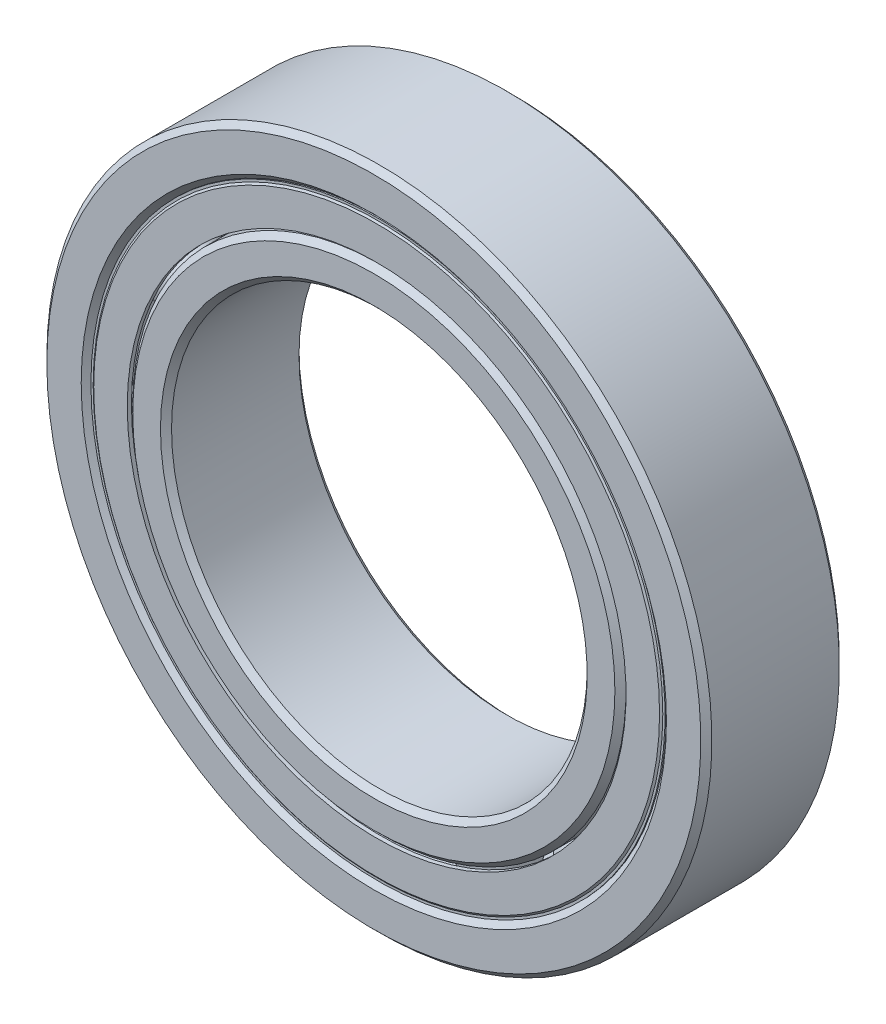
ISO-10303-21;
HEADER;
FILE_DESCRIPTION(('STEP AP214'),'2;1');
FILE_NAME('part.step','',(''),(''),'','','');
FILE_SCHEMA(('AUTOMOTIVE_DESIGN { 1 0 10303 214 1 1 1 1 }'));
ENDSEC;
DATA;
#1=APPLICATION_CONTEXT('core data for automotive mechanical design processes');
#2=APPLICATION_PROTOCOL_DEFINITION('international standard','automotive_design',2000,#1);
#3=PRODUCT_CONTEXT('',#1,'mechanical');
#4=PRODUCT('Part','Part','',(#3));
#5=PRODUCT_RELATED_PRODUCT_CATEGORY('part','',(#4));
#6=PRODUCT_DEFINITION_FORMATION('','',#4);
#7=PRODUCT_DEFINITION_CONTEXT('part definition',#1,'design');
#8=PRODUCT_DEFINITION('design','',#6,#7);
#9=PRODUCT_DEFINITION_SHAPE('','',#8);
#10=(LENGTH_UNIT() NAMED_UNIT(*) SI_UNIT(.MILLI.,.METRE.));
#11=(NAMED_UNIT(*) PLANE_ANGLE_UNIT() SI_UNIT($,.RADIAN.));
#12=(NAMED_UNIT(*) SI_UNIT($,.STERADIAN.) SOLID_ANGLE_UNIT());
#13=UNCERTAINTY_MEASURE_WITH_UNIT(LENGTH_MEASURE(1.E-05),#10,'distance_accuracy_value','');
#14=(GEOMETRIC_REPRESENTATION_CONTEXT(3) GLOBAL_UNCERTAINTY_ASSIGNED_CONTEXT((#13)) GLOBAL_UNIT_ASSIGNED_CONTEXT((#10,
#11,#12)) REPRESENTATION_CONTEXT('',''));
#15=CARTESIAN_POINT('',(0.,0.,0.));
#16=DIRECTION('',(0.,0.,1.));
#17=DIRECTION('',(1.,0.,0.));
#18=AXIS2_PLACEMENT_3D('',#15,#16,#17);
#19=CARTESIAN_POINT('',(-9.1586742519223,2.97583365583084,0.));
#20=DIRECTION('',(0.,0.,1.));
#21=DIRECTION('',(-0.95105651629515,0.309016994374957,0.));
#22=AXIS2_PLACEMENT_3D('',#19,#20,#21);
#23=SPHERICAL_SURFACE('',#22,1.1905);
#24=CARTESIAN_POINT('',(-9.1586742519223,2.97583365583084,1.1905));
#25=VERTEX_POINT('',#24);
#26=VERTEX_LOOP('',#25);
#27=FACE_BOUND('',#26,.T.);
#28=ADVANCED_FACE('P0_F13',(#27),#23,.T.);
#29=CLOSED_SHELL('',(#28));
#30=MANIFOLD_SOLID_BREP('P0_B1',#29);
#31=CARTESIAN_POINT('',(-7.15648466934723,6.44372773923589,0.));
#32=DIRECTION('',(0.,0.,1.));
#33=DIRECTION('',(-0.743144825477386,0.669130606358867,0.));
#34=AXIS2_PLACEMENT_3D('',#31,#32,#33);
#35=SPHERICAL_SURFACE('',#34,1.1905);
#36=CARTESIAN_POINT('',(-7.15648466934723,6.44372773923589,1.1905));
#37=VERTEX_POINT('',#36);
#38=VERTEX_LOOP('',#37);
#39=FACE_BOUND('',#38,.T.);
#40=ADVANCED_FACE('P1_F13',(#39),#35,.T.);
#41=CLOSED_SHELL('',(#40));
#42=MANIFOLD_SOLID_BREP('P1_B1',#41);
#43=CARTESIAN_POINT('',(-3.91687387281985,8.7974427570983,0.));
#44=DIRECTION('',(0.,0.,1.));
#45=DIRECTION('',(-0.406736643075789,0.913545457642606,0.));
#46=AXIS2_PLACEMENT_3D('',#43,#44,#45);
#47=SPHERICAL_SURFACE('',#46,1.1905);
#48=CARTESIAN_POINT('',(-3.91687387281985,8.7974427570983,1.1905));
#49=VERTEX_POINT('',#48);
#50=VERTEX_LOOP('',#49);
#51=FACE_BOUND('',#50,.T.);
#52=ADVANCED_FACE('P2_F13',(#51),#47,.T.);
#53=CLOSED_SHELL('',(#52));
#54=MANIFOLD_SOLID_BREP('P2_B1',#53);
#55=CARTESIAN_POINT('',(0.,10.21,2.21501856481158));
#56=DIRECTION('',(0.,0.,-1.));
#57=DIRECTION('',(-1.,0.,0.));
#58=AXIS2_PLACEMENT_3D('',#55,#56,#57);
#59=PLANE('',#58);
#60=CARTESIAN_POINT('',(0.,0.,2.21501856481158));
#61=DIRECTION('',(0.,0.,-1.));
#62=DIRECTION('',(-1.,0.,0.));
#63=AXIS2_PLACEMENT_3D('',#60,#61,#62);
#64=CIRCLE('',#63,10.36);
#65=CARTESIAN_POINT('',(-10.36,0.,2.21501856481158));
#66=VERTEX_POINT('',#65);
#67=EDGE_CURVE('P3_E43',#66,#66,#64,.T.);
#68=ORIENTED_EDGE('',*,*,#67,.T.);
#69=EDGE_LOOP('',(#68));
#70=FACE_BOUND('',#69,.T.);
#71=CARTESIAN_POINT('',(0.,0.,2.21501856481158));
#72=DIRECTION('',(0.,0.,-1.));
#73=DIRECTION('',(-1.,0.,0.));
#74=AXIS2_PLACEMENT_3D('',#71,#72,#73);
#75=CIRCLE('',#74,10.21);
#76=CARTESIAN_POINT('',(-10.21,0.,2.21501856481158));
#77=VERTEX_POINT('',#76);
#78=EDGE_CURVE('P3_E10',#77,#77,#75,.T.);
#79=ORIENTED_EDGE('',*,*,#78,.F.);
#80=EDGE_LOOP('',(#79));
#81=FACE_BOUND('',#80,.T.);
#82=ADVANCED_FACE('P3_F15',(#70,#81),#59,.T.);
#83=CARTESIAN_POINT('',(0.,0.,2.2481347531258));
#84=DIRECTION('',(0.,0.,-1.));
#85=DIRECTION('',(-1.,0.,0.));
#86=AXIS2_PLACEMENT_3D('',#83,#84,#85);
#87=CONICAL_SURFACE('',#86,10.1627051816681,0.959931088596877);
#88=ORIENTED_EDGE('',*,*,#78,.T.);
#89=EDGE_LOOP('',(#88));
#90=FACE_BOUND('',#89,.T.);
#91=CARTESIAN_POINT('',(0.,0.,2.2481347531258));
#92=DIRECTION('',(0.,0.,-1.));
#93=DIRECTION('',(-1.,0.,0.));
#94=AXIS2_PLACEMENT_3D('',#91,#92,#93);
#95=CIRCLE('',#94,10.1627051816681);
#96=CARTESIAN_POINT('',(-10.1627051816681,0.,2.2481347531258));
#97=VERTEX_POINT('',#96);
#98=EDGE_CURVE('P3_E21',#97,#97,#95,.T.);
#99=ORIENTED_EDGE('',*,*,#98,.F.);
#100=EDGE_LOOP('',(#99));
#101=FACE_BOUND('',#100,.T.);
#102=ADVANCED_FACE('P3_F63',(#90,#101),#87,.F.);
#103=CARTESIAN_POINT('',(0.,10.1627051816681,2.2481347531258));
#104=DIRECTION('',(0.,0.,-1.));
#105=DIRECTION('',(-1.,0.,0.));
#106=AXIS2_PLACEMENT_3D('',#103,#104,#105);
#107=PLANE('',#106);
#108=ORIENTED_EDGE('',*,*,#98,.T.);
#109=EDGE_LOOP('',(#108));
#110=FACE_BOUND('',#109,.T.);
#111=CARTESIAN_POINT('',(0.,0.,2.2481347531258));
#112=DIRECTION('',(0.,0.,-1.));
#113=DIRECTION('',(-1.,0.,0.));
#114=AXIS2_PLACEMENT_3D('',#111,#112,#113);
#115=CIRCLE('',#114,9.);
#116=CARTESIAN_POINT('',(-9.,0.,2.2481347531258));
#117=VERTEX_POINT('',#116);
#118=EDGE_CURVE('P3_E25',#117,#117,#115,.T.);
#119=ORIENTED_EDGE('',*,*,#118,.F.);
#120=EDGE_LOOP('',(#119));
#121=FACE_BOUND('',#120,.T.);
#122=ADVANCED_FACE('P3_F68',(#110,#121),#107,.T.);
#123=CARTESIAN_POINT('',(0.,0.,0.));
#124=DIRECTION('',(0.,0.,-1.));
#125=DIRECTION('',(-1.,0.,0.));
#126=AXIS2_PLACEMENT_3D('',#123,#124,#125);
#127=CYLINDRICAL_SURFACE('',#126,9.);
#128=ORIENTED_EDGE('',*,*,#118,.T.);
#129=EDGE_LOOP('',(#128));
#130=FACE_BOUND('',#129,.T.);
#131=CARTESIAN_POINT('',(0.,0.,2.3981347531258));
#132=DIRECTION('',(0.,0.,-1.));
#133=DIRECTION('',(-1.,0.,0.));
#134=AXIS2_PLACEMENT_3D('',#131,#132,#133);
#135=CIRCLE('',#134,9.);
#136=CARTESIAN_POINT('',(-9.,0.,2.3981347531258));
#137=VERTEX_POINT('',#136);
#138=EDGE_CURVE('P3_E29',#137,#137,#135,.T.);
#139=ORIENTED_EDGE('',*,*,#138,.F.);
#140=EDGE_LOOP('',(#139));
#141=FACE_BOUND('',#140,.T.);
#142=ADVANCED_FACE('P3_F73',(#130,#141),#127,.F.);
#143=CARTESIAN_POINT('',(0.,10.21,2.3981347531258));
#144=DIRECTION('',(0.,0.,1.));
#145=DIRECTION('',(1.,0.,0.));
#146=AXIS2_PLACEMENT_3D('',#143,#144,#145);
#147=PLANE('',#146);
#148=ORIENTED_EDGE('',*,*,#138,.T.);
#149=EDGE_LOOP('',(#148));
#150=FACE_BOUND('',#149,.T.);
#151=CARTESIAN_POINT('',(0.,0.,2.3981347531258));
#152=DIRECTION('',(0.,0.,-1.));
#153=DIRECTION('',(-1.,0.,0.));
#154=AXIS2_PLACEMENT_3D('',#151,#152,#153);
#155=CIRCLE('',#154,10.21);
#156=CARTESIAN_POINT('',(-10.21,0.,2.3981347531258));
#157=VERTEX_POINT('',#156);
#158=EDGE_CURVE('P3_E34',#157,#157,#155,.T.);
#159=ORIENTED_EDGE('',*,*,#158,.F.);
#160=EDGE_LOOP('',(#159));
#161=FACE_BOUND('',#160,.T.);
#162=ADVANCED_FACE('P3_F79',(#150,#161),#147,.T.);
#163=CARTESIAN_POINT('',(0.,0.,2.35));
#164=DIRECTION('',(0.,0.,-1.));
#165=DIRECTION('',(-1.,0.,0.));
#166=AXIS2_PLACEMENT_3D('',#163,#164,#165);
#167=CONICAL_SURFACE('',#166,10.2787435517316,0.959931088596883);
#168=ORIENTED_EDGE('',*,*,#158,.T.);
#169=EDGE_LOOP('',(#168));
#170=FACE_BOUND('',#169,.T.);
#171=CARTESIAN_POINT('',(0.,0.,2.35));
#172=DIRECTION('',(0.,0.,-1.));
#173=DIRECTION('',(-1.,0.,0.));
#174=AXIS2_PLACEMENT_3D('',#171,#172,#173);
#175=CIRCLE('',#174,10.2787435517316);
#176=CARTESIAN_POINT('',(-10.2787435517316,0.,2.35));
#177=VERTEX_POINT('',#176);
#178=EDGE_CURVE('P3_E37',#177,#177,#175,.T.);
#179=ORIENTED_EDGE('',*,*,#178,.F.);
#180=EDGE_LOOP('',(#179));
#181=FACE_BOUND('',#180,.T.);
#182=ADVANCED_FACE('P3_F59',(#170,#181),#167,.T.);
#183=CARTESIAN_POINT('',(0.,10.36,2.35));
#184=DIRECTION('',(0.,0.,1.));
#185=DIRECTION('',(1.,0.,0.));
#186=AXIS2_PLACEMENT_3D('',#183,#184,#185);
#187=PLANE('',#186);
#188=ORIENTED_EDGE('',*,*,#178,.T.);
#189=EDGE_LOOP('',(#188));
#190=FACE_BOUND('',#189,.T.);
#191=CARTESIAN_POINT('',(0.,0.,2.35));
#192=DIRECTION('',(0.,0.,-1.));
#193=DIRECTION('',(-1.,0.,0.));
#194=AXIS2_PLACEMENT_3D('',#191,#192,#193);
#195=CIRCLE('',#194,10.36);
#196=CARTESIAN_POINT('',(-10.36,0.,2.35));
#197=VERTEX_POINT('',#196);
#198=EDGE_CURVE('P3_E40',#197,#197,#195,.T.);
#199=ORIENTED_EDGE('',*,*,#198,.F.);
#200=EDGE_LOOP('',(#199));
#201=FACE_BOUND('',#200,.T.);
#202=ADVANCED_FACE('P3_F51',(#190,#201),#187,.T.);
#203=CARTESIAN_POINT('',(0.,0.,0.));
#204=DIRECTION('',(0.,0.,-1.));
#205=DIRECTION('',(-1.,0.,0.));
#206=AXIS2_PLACEMENT_3D('',#203,#204,#205);
#207=CYLINDRICAL_SURFACE('',#206,10.36);
#208=ORIENTED_EDGE('',*,*,#198,.T.);
#209=EDGE_LOOP('',(#208));
#210=FACE_BOUND('',#209,.T.);
#211=ORIENTED_EDGE('',*,*,#67,.F.);
#212=EDGE_LOOP('',(#211));
#213=FACE_BOUND('',#212,.T.);
#214=ADVANCED_FACE('P3_F49',(#210,#213),#207,.T.);
#215=CLOSED_SHELL('',(#82,#102,#122,#142,#162,#182,#202,#214));
#216=MANIFOLD_SOLID_BREP('P3_B1',#215);
#217=CARTESIAN_POINT('',(0.,9.63,0.));
#218=DIRECTION('',(0.,0.,1.));
#219=DIRECTION('',(0.,1.,0.));
#220=AXIS2_PLACEMENT_3D('',#217,#218,#219);
#221=SPHERICAL_SURFACE('',#220,1.1905);
#222=CARTESIAN_POINT('',(0.,9.63,1.1905));
#223=VERTEX_POINT('',#222);
#224=VERTEX_LOOP('',#223);
#225=FACE_BOUND('',#224,.T.);
#226=ADVANCED_FACE('P4_F13',(#225),#221,.T.);
#227=CLOSED_SHELL('',(#226));
#228=MANIFOLD_SOLID_BREP('P4_B1',#227);
#229=CARTESIAN_POINT('',(3.91687387281997,8.79744275709824,0.));
#230=DIRECTION('',(0.,0.,1.));
#231=DIRECTION('',(0.406736643075801,0.913545457642601,0.));
#232=AXIS2_PLACEMENT_3D('',#229,#230,#231);
#233=SPHERICAL_SURFACE('',#232,1.1905);
#234=CARTESIAN_POINT('',(3.91687387281997,8.79744275709824,1.1905));
#235=VERTEX_POINT('',#234);
#236=VERTEX_LOOP('',#235);
#237=FACE_BOUND('',#236,.T.);
#238=ADVANCED_FACE('P5_F13',(#237),#233,.T.);
#239=CLOSED_SHELL('',(#238));
#240=MANIFOLD_SOLID_BREP('P5_B1',#239);
#241=CARTESIAN_POINT('',(7.15648466934732,6.44372773923579,0.));
#242=DIRECTION('',(0.,0.,1.));
#243=DIRECTION('',(0.743144825477396,0.669130606358857,0.));
#244=AXIS2_PLACEMENT_3D('',#241,#242,#243);
#245=SPHERICAL_SURFACE('',#244,1.1905);
#246=CARTESIAN_POINT('',(7.15648466934732,6.44372773923579,1.1905));
#247=VERTEX_POINT('',#246);
#248=VERTEX_LOOP('',#247);
#249=FACE_BOUND('',#248,.T.);
#250=ADVANCED_FACE('P6_F13',(#249),#245,.T.);
#251=CLOSED_SHELL('',(#250));
#252=MANIFOLD_SOLID_BREP('P6_B1',#251);
#253=CARTESIAN_POINT('',(9.15867425192234,2.97583365583072,0.));
#254=DIRECTION('',(0.,0.,1.));
#255=DIRECTION('',(0.951056516295154,0.309016994374945,0.));
#256=AXIS2_PLACEMENT_3D('',#253,#254,#255);
#257=SPHERICAL_SURFACE('',#256,1.1905);
#258=CARTESIAN_POINT('',(9.15867425192234,2.97583365583072,1.1905));
#259=VERTEX_POINT('',#258);
#260=VERTEX_LOOP('',#259);
#261=FACE_BOUND('',#260,.T.);
#262=ADVANCED_FACE('P7_F13',(#261),#257,.T.);
#263=CLOSED_SHELL('',(#262));
#264=MANIFOLD_SOLID_BREP('P7_B1',#263);
#265=CARTESIAN_POINT('',(9.57724585239647,-1.00660910126754,0.));
#266=DIRECTION('',(0.,0.,1.));
#267=DIRECTION('',(0.994521895368273,-0.104528463267657,0.));
#268=AXIS2_PLACEMENT_3D('',#265,#266,#267);
#269=SPHERICAL_SURFACE('',#268,1.1905);
#270=CARTESIAN_POINT('',(9.57724585239647,-1.00660910126754,1.1905));
#271=VERTEX_POINT('',#270);
#272=VERTEX_LOOP('',#271);
#273=FACE_BOUND('',#272,.T.);
#274=ADVANCED_FACE('P8_F13',(#273),#269,.T.);
#275=CLOSED_SHELL('',(#274));
#276=MANIFOLD_SOLID_BREP('P8_B1',#275);
#277=CARTESIAN_POINT('',(0.,0.,0.));
#278=DIRECTION('',(0.,0.,-1.));
#279=DIRECTION('',(-1.,0.,0.));
#280=AXIS2_PLACEMENT_3D('',#277,#278,#279);
#281=TOROIDAL_SURFACE('',#280,9.63,0.74188633318957);
#282=CARTESIAN_POINT('',(0.,0.,-0.132269918626519));
#283=DIRECTION('',(0.,0.,-1.));
#284=DIRECTION('',(-1.,0.,0.));
#285=AXIS2_PLACEMENT_3D('',#282,#283,#284);
#286=CIRCLE('',#285,10.36);
#287=CARTESIAN_POINT('',(-10.36,0.,-0.132269918626519));
#288=VERTEX_POINT('',#287);
#289=EDGE_CURVE('P9_E10',#288,#288,#286,.T.);
#290=ORIENTED_EDGE('',*,*,#289,.T.);
#291=EDGE_LOOP('',(#290));
#292=FACE_BOUND('',#291,.T.);
#293=CARTESIAN_POINT('',(0.,0.,0.132269918626519));
#294=DIRECTION('',(0.,0.,-1.));
#295=DIRECTION('',(-1.,0.,0.));
#296=AXIS2_PLACEMENT_3D('',#293,#294,#295);
#297=CIRCLE('',#296,10.36);
#298=CARTESIAN_POINT('',(-10.36,0.,0.132269918626519));
#299=VERTEX_POINT('',#298);
#300=EDGE_CURVE('P9_E49',#299,#299,#297,.T.);
#301=ORIENTED_EDGE('',*,*,#300,.F.);
#302=EDGE_LOOP('',(#301));
#303=FACE_BOUND('',#302,.T.);
#304=ADVANCED_FACE('P9_F15',(#292,#303),#281,.F.);
#305=CARTESIAN_POINT('',(0.,0.,0.));
#306=DIRECTION('',(0.,0.,-1.));
#307=DIRECTION('',(-1.,0.,0.));
#308=AXIS2_PLACEMENT_3D('',#305,#306,#307);
#309=CYLINDRICAL_SURFACE('',#308,10.36);
#310=CARTESIAN_POINT('',(0.,0.,-2.3));
#311=DIRECTION('',(0.,0.,-1.));
#312=DIRECTION('',(-1.,0.,0.));
#313=AXIS2_PLACEMENT_3D('',#310,#311,#312);
#314=CIRCLE('',#313,10.36);
#315=CARTESIAN_POINT('',(-10.36,0.,-2.3));
#316=VERTEX_POINT('',#315);
#317=EDGE_CURVE('P9_E21',#316,#316,#314,.T.);
#318=ORIENTED_EDGE('',*,*,#317,.T.);
#319=EDGE_LOOP('',(#318));
#320=FACE_BOUND('',#319,.T.);
#321=ORIENTED_EDGE('',*,*,#289,.F.);
#322=EDGE_LOOP('',(#321));
#323=FACE_BOUND('',#322,.T.);
#324=ADVANCED_FACE('P9_F57',(#320,#323),#309,.F.);
#325=CARTESIAN_POINT('',(0.,0.,-2.3));
#326=DIRECTION('',(0.,0.,-1.));
#327=DIRECTION('',(-1.,0.,0.));
#328=AXIS2_PLACEMENT_3D('',#325,#326,#327);
#329=CONICAL_SURFACE('',#328,10.36,0.785398163397448);
#330=CARTESIAN_POINT('',(0.,0.,-2.5));
#331=DIRECTION('',(0.,0.,-1.));
#332=DIRECTION('',(-1.,0.,0.));
#333=AXIS2_PLACEMENT_3D('',#330,#331,#332);
#334=CIRCLE('',#333,10.56);
#335=CARTESIAN_POINT('',(-10.56,0.,-2.5));
#336=VERTEX_POINT('',#335);
#337=EDGE_CURVE('P9_E25',#336,#336,#334,.T.);
#338=ORIENTED_EDGE('',*,*,#337,.T.);
#339=EDGE_LOOP('',(#338));
#340=FACE_BOUND('',#339,.T.);
#341=ORIENTED_EDGE('',*,*,#317,.F.);
#342=EDGE_LOOP('',(#341));
#343=FACE_BOUND('',#342,.T.);
#344=ADVANCED_FACE('P9_F63',(#340,#343),#329,.F.);
#345=CARTESIAN_POINT('',(0.,10.56,-2.5));
#346=DIRECTION('',(0.,0.,-1.));
#347=DIRECTION('',(-1.,0.,0.));
#348=AXIS2_PLACEMENT_3D('',#345,#346,#347);
#349=PLANE('',#348);
#350=CARTESIAN_POINT('',(0.,0.,-2.5));
#351=DIRECTION('',(0.,0.,-1.));
#352=DIRECTION('',(-1.,0.,0.));
#353=AXIS2_PLACEMENT_3D('',#350,#351,#352);
#354=CIRCLE('',#353,11.8);
#355=CARTESIAN_POINT('',(-11.8,0.,-2.5));
#356=VERTEX_POINT('',#355);
#357=EDGE_CURVE('P9_E29',#356,#356,#354,.T.);
#358=ORIENTED_EDGE('',*,*,#357,.T.);
#359=EDGE_LOOP('',(#358));
#360=FACE_BOUND('',#359,.T.);
#361=ORIENTED_EDGE('',*,*,#337,.F.);
#362=EDGE_LOOP('',(#361));
#363=FACE_BOUND('',#362,.T.);
#364=ADVANCED_FACE('P9_F68',(#360,#363),#349,.T.);
#365=CARTESIAN_POINT('',(0.,0.,-2.5));
#366=DIRECTION('',(0.,0.,1.));
#367=DIRECTION('',(1.,0.,0.));
#368=AXIS2_PLACEMENT_3D('',#365,#366,#367);
#369=CONICAL_SURFACE('',#368,11.8,0.785398163397448);
#370=CARTESIAN_POINT('',(0.,0.,-2.3));
#371=DIRECTION('',(0.,0.,-1.));
#372=DIRECTION('',(-1.,0.,0.));
#373=AXIS2_PLACEMENT_3D('',#370,#371,#372);
#374=CIRCLE('',#373,12.);
#375=CARTESIAN_POINT('',(-12.,0.,-2.3));
#376=VERTEX_POINT('',#375);
#377=EDGE_CURVE('P9_E34',#376,#376,#374,.T.);
#378=ORIENTED_EDGE('',*,*,#377,.T.);
#379=EDGE_LOOP('',(#378));
#380=FACE_BOUND('',#379,.T.);
#381=ORIENTED_EDGE('',*,*,#357,.F.);
#382=EDGE_LOOP('',(#381));
#383=FACE_BOUND('',#382,.T.);
#384=ADVANCED_FACE('P9_F75',(#380,#383),#369,.T.);
#385=CARTESIAN_POINT('',(0.,0.,0.));
#386=DIRECTION('',(0.,0.,-1.));
#387=DIRECTION('',(-1.,0.,0.));
#388=AXIS2_PLACEMENT_3D('',#385,#386,#387);
#389=CYLINDRICAL_SURFACE('',#388,12.);
#390=CARTESIAN_POINT('',(0.,0.,2.3));
#391=DIRECTION('',(0.,0.,-1.));
#392=DIRECTION('',(-1.,0.,0.));
#393=AXIS2_PLACEMENT_3D('',#390,#391,#392);
#394=CIRCLE('',#393,12.);
#395=CARTESIAN_POINT('',(-12.,0.,2.3));
#396=VERTEX_POINT('',#395);
#397=EDGE_CURVE('P9_E37',#396,#396,#394,.T.);
#398=ORIENTED_EDGE('',*,*,#397,.T.);
#399=EDGE_LOOP('',(#398));
#400=FACE_BOUND('',#399,.T.);
#401=ORIENTED_EDGE('',*,*,#377,.F.);
#402=EDGE_LOOP('',(#401));
#403=FACE_BOUND('',#402,.T.);
#404=ADVANCED_FACE('P9_F79',(#400,#403),#389,.T.);
#405=CARTESIAN_POINT('',(0.,0.,2.3));
#406=DIRECTION('',(0.,0.,-1.));
#407=DIRECTION('',(-1.,0.,0.));
#408=AXIS2_PLACEMENT_3D('',#405,#406,#407);
#409=CONICAL_SURFACE('',#408,12.,0.785398163397455);
#410=CARTESIAN_POINT('',(0.,0.,2.5));
#411=DIRECTION('',(0.,0.,-1.));
#412=DIRECTION('',(-1.,0.,0.));
#413=AXIS2_PLACEMENT_3D('',#410,#411,#412);
#414=CIRCLE('',#413,11.8);
#415=CARTESIAN_POINT('',(-11.8,0.,2.5));
#416=VERTEX_POINT('',#415);
#417=EDGE_CURVE('P9_E40',#416,#416,#414,.T.);
#418=ORIENTED_EDGE('',*,*,#417,.T.);
#419=EDGE_LOOP('',(#418));
#420=FACE_BOUND('',#419,.T.);
#421=ORIENTED_EDGE('',*,*,#397,.F.);
#422=EDGE_LOOP('',(#421));
#423=FACE_BOUND('',#422,.T.);
#424=ADVANCED_FACE('P9_F83',(#420,#423),#409,.T.);
#425=CARTESIAN_POINT('',(0.,11.8,2.5));
#426=DIRECTION('',(0.,0.,1.));
#427=DIRECTION('',(1.,0.,0.));
#428=AXIS2_PLACEMENT_3D('',#425,#426,#427);
#429=PLANE('',#428);
#430=CARTESIAN_POINT('',(0.,0.,2.5));
#431=DIRECTION('',(0.,0.,-1.));
#432=DIRECTION('',(-1.,0.,0.));
#433=AXIS2_PLACEMENT_3D('',#430,#431,#432);
#434=CIRCLE('',#433,10.56);
#435=CARTESIAN_POINT('',(-10.56,0.,2.5));
#436=VERTEX_POINT('',#435);
#437=EDGE_CURVE('P9_E43',#436,#436,#434,.T.);
#438=ORIENTED_EDGE('',*,*,#437,.T.);
#439=EDGE_LOOP('',(#438));
#440=FACE_BOUND('',#439,.T.);
#441=ORIENTED_EDGE('',*,*,#417,.F.);
#442=EDGE_LOOP('',(#441));
#443=FACE_BOUND('',#442,.T.);
#444=ADVANCED_FACE('P9_F87',(#440,#443),#429,.T.);
#445=CARTESIAN_POINT('',(0.,0.,2.5));
#446=DIRECTION('',(0.,0.,1.));
#447=DIRECTION('',(1.,0.,0.));
#448=AXIS2_PLACEMENT_3D('',#445,#446,#447);
#449=CONICAL_SURFACE('',#448,10.56,0.785398163397448);
#450=CARTESIAN_POINT('',(0.,0.,2.3));
#451=DIRECTION('',(0.,0.,-1.));
#452=DIRECTION('',(-1.,0.,0.));
#453=AXIS2_PLACEMENT_3D('',#450,#451,#452);
#454=CIRCLE('',#453,10.36);
#455=CARTESIAN_POINT('',(-10.36,0.,2.3));
#456=VERTEX_POINT('',#455);
#457=EDGE_CURVE('P9_E46',#456,#456,#454,.T.);
#458=ORIENTED_EDGE('',*,*,#457,.T.);
#459=EDGE_LOOP('',(#458));
#460=FACE_BOUND('',#459,.T.);
#461=ORIENTED_EDGE('',*,*,#437,.F.);
#462=EDGE_LOOP('',(#461));
#463=FACE_BOUND('',#462,.T.);
#464=ADVANCED_FACE('P9_F91',(#460,#463),#449,.F.);
#465=CARTESIAN_POINT('',(0.,0.,0.));
#466=DIRECTION('',(0.,0.,-1.));
#467=DIRECTION('',(-1.,0.,0.));
#468=AXIS2_PLACEMENT_3D('',#465,#466,#467);
#469=CYLINDRICAL_SURFACE('',#468,10.36);
#470=ORIENTED_EDGE('',*,*,#300,.T.);
#471=EDGE_LOOP('',(#470));
#472=FACE_BOUND('',#471,.T.);
#473=ORIENTED_EDGE('',*,*,#457,.F.);
#474=EDGE_LOOP('',(#473));
#475=FACE_BOUND('',#474,.T.);
#476=ADVANCED_FACE('P9_F53',(#472,#475),#469,.F.);
#477=CLOSED_SHELL('',(#304,#324,#344,#364,#384,#404,#424,#444,#464,#476));
#478=MANIFOLD_SOLID_BREP('P9_B1',#477);
#479=CARTESIAN_POINT('',(8.33982463844412,-4.815,0.));
#480=DIRECTION('',(0.,0.,1.));
#481=DIRECTION('',(0.866025403784437,-0.5,0.));
#482=AXIS2_PLACEMENT_3D('',#479,#480,#481);
#483=SPHERICAL_SURFACE('',#482,1.1905);
#484=CARTESIAN_POINT('',(8.33982463844412,-4.815,1.1905));
#485=VERTEX_POINT('',#484);
#486=VERTEX_LOOP('',#485);
#487=FACE_BOUND('',#486,.T.);
#488=ADVANCED_FACE('P10_F13',(#487),#483,.T.);
#489=CLOSED_SHELL('',(#488));
#490=MANIFOLD_SOLID_BREP('P10_B1',#489);
#491=CARTESIAN_POINT('',(0.,0.,0.));
#492=DIRECTION('',(0.,0.,-1.));
#493=DIRECTION('',(-1.,0.,0.));
#494=AXIS2_PLACEMENT_3D('',#491,#492,#493);
#495=TOROIDAL_SURFACE('',#494,9.63,0.74188633318957);
#496=CARTESIAN_POINT('',(0.,0.,0.132269918626519));
#497=DIRECTION('',(0.,0.,-1.));
#498=DIRECTION('',(-1.,0.,0.));
#499=AXIS2_PLACEMENT_3D('',#496,#497,#498);
#500=CIRCLE('',#499,8.9);
#501=CARTESIAN_POINT('',(-8.9,0.,0.132269918626519));
#502=VERTEX_POINT('',#501);
#503=EDGE_CURVE('P11_E10',#502,#502,#500,.T.);
#504=ORIENTED_EDGE('',*,*,#503,.T.);
#505=EDGE_LOOP('',(#504));
#506=FACE_BOUND('',#505,.T.);
#507=CARTESIAN_POINT('',(0.,0.,-0.132269918626519));
#508=DIRECTION('',(0.,0.,-1.));
#509=DIRECTION('',(-1.,0.,0.));
#510=AXIS2_PLACEMENT_3D('',#507,#508,#509);
#511=CIRCLE('',#510,8.9);
#512=CARTESIAN_POINT('',(-8.9,0.,-0.132269918626519));
#513=VERTEX_POINT('',#512);
#514=EDGE_CURVE('P11_E49',#513,#513,#511,.T.);
#515=ORIENTED_EDGE('',*,*,#514,.F.);
#516=EDGE_LOOP('',(#515));
#517=FACE_BOUND('',#516,.T.);
#518=ADVANCED_FACE('P11_F15',(#506,#517),#495,.F.);
#519=CARTESIAN_POINT('',(0.,0.,0.));
#520=DIRECTION('',(0.,0.,-1.));
#521=DIRECTION('',(-1.,0.,0.));
#522=AXIS2_PLACEMENT_3D('',#519,#520,#521);
#523=CYLINDRICAL_SURFACE('',#522,8.9);
#524=CARTESIAN_POINT('',(0.,0.,2.3));
#525=DIRECTION('',(0.,0.,-1.));
#526=DIRECTION('',(-1.,0.,0.));
#527=AXIS2_PLACEMENT_3D('',#524,#525,#526);
#528=CIRCLE('',#527,8.9);
#529=CARTESIAN_POINT('',(-8.9,0.,2.3));
#530=VERTEX_POINT('',#529);
#531=EDGE_CURVE('P11_E21',#530,#530,#528,.T.);
#532=ORIENTED_EDGE('',*,*,#531,.T.);
#533=EDGE_LOOP('',(#532));
#534=FACE_BOUND('',#533,.T.);
#535=ORIENTED_EDGE('',*,*,#503,.F.);
#536=EDGE_LOOP('',(#535));
#537=FACE_BOUND('',#536,.T.);
#538=ADVANCED_FACE('P11_F57',(#534,#537),#523,.T.);
#539=CARTESIAN_POINT('',(0.,0.,2.3));
#540=DIRECTION('',(0.,0.,-1.));
#541=DIRECTION('',(-1.,0.,0.));
#542=AXIS2_PLACEMENT_3D('',#539,#540,#541);
#543=CONICAL_SURFACE('',#542,8.9,0.785398163397448);
#544=CARTESIAN_POINT('',(0.,0.,2.5));
#545=DIRECTION('',(0.,0.,-1.));
#546=DIRECTION('',(-1.,0.,0.));
#547=AXIS2_PLACEMENT_3D('',#544,#545,#546);
#548=CIRCLE('',#547,8.7);
#549=CARTESIAN_POINT('',(-8.7,0.,2.5));
#550=VERTEX_POINT('',#549);
#551=EDGE_CURVE('P11_E25',#550,#550,#548,.T.);
#552=ORIENTED_EDGE('',*,*,#551,.T.);
#553=EDGE_LOOP('',(#552));
#554=FACE_BOUND('',#553,.T.);
#555=ORIENTED_EDGE('',*,*,#531,.F.);
#556=EDGE_LOOP('',(#555));
#557=FACE_BOUND('',#556,.T.);
#558=ADVANCED_FACE('P11_F63',(#554,#557),#543,.T.);
#559=CARTESIAN_POINT('',(0.,7.7,2.5));
#560=DIRECTION('',(0.,0.,1.));
#561=DIRECTION('',(1.,0.,0.));
#562=AXIS2_PLACEMENT_3D('',#559,#560,#561);
#563=PLANE('',#562);
#564=CARTESIAN_POINT('',(0.,0.,2.5));
#565=DIRECTION('',(0.,0.,-1.));
#566=DIRECTION('',(-1.,0.,0.));
#567=AXIS2_PLACEMENT_3D('',#564,#565,#566);
#568=CIRCLE('',#567,7.7);
#569=CARTESIAN_POINT('',(-7.7,0.,2.5));
#570=VERTEX_POINT('',#569);
#571=EDGE_CURVE('P11_E29',#570,#570,#568,.T.);
#572=ORIENTED_EDGE('',*,*,#571,.T.);
#573=EDGE_LOOP('',(#572));
#574=FACE_BOUND('',#573,.T.);
#575=ORIENTED_EDGE('',*,*,#551,.F.);
#576=EDGE_LOOP('',(#575));
#577=FACE_BOUND('',#576,.T.);
#578=ADVANCED_FACE('P11_F68',(#574,#577),#563,.T.);
#579=CARTESIAN_POINT('',(0.,0.,2.5));
#580=DIRECTION('',(0.,0.,1.));
#581=DIRECTION('',(1.,0.,0.));
#582=AXIS2_PLACEMENT_3D('',#579,#580,#581);
#583=CONICAL_SURFACE('',#582,7.7,0.785398163397452);
#584=CARTESIAN_POINT('',(0.,0.,2.3));
#585=DIRECTION('',(0.,0.,-1.));
#586=DIRECTION('',(-1.,0.,0.));
#587=AXIS2_PLACEMENT_3D('',#584,#585,#586);
#588=CIRCLE('',#587,7.5);
#589=CARTESIAN_POINT('',(-7.5,0.,2.3));
#590=VERTEX_POINT('',#589);
#591=EDGE_CURVE('P11_E34',#590,#590,#588,.T.);
#592=ORIENTED_EDGE('',*,*,#591,.T.);
#593=EDGE_LOOP('',(#592));
#594=FACE_BOUND('',#593,.T.);
#595=ORIENTED_EDGE('',*,*,#571,.F.);
#596=EDGE_LOOP('',(#595));
#597=FACE_BOUND('',#596,.T.);
#598=ADVANCED_FACE('P11_F75',(#594,#597),#583,.F.);
#599=CARTESIAN_POINT('',(0.,0.,0.));
#600=DIRECTION('',(0.,0.,-1.));
#601=DIRECTION('',(-1.,0.,0.));
#602=AXIS2_PLACEMENT_3D('',#599,#600,#601);
#603=CYLINDRICAL_SURFACE('',#602,7.5);
#604=CARTESIAN_POINT('',(0.,0.,-2.3));
#605=DIRECTION('',(0.,0.,-1.));
#606=DIRECTION('',(-1.,0.,0.));
#607=AXIS2_PLACEMENT_3D('',#604,#605,#606);
#608=CIRCLE('',#607,7.5);
#609=CARTESIAN_POINT('',(-7.5,0.,-2.3));
#610=VERTEX_POINT('',#609);
#611=EDGE_CURVE('P11_E37',#610,#610,#608,.T.);
#612=ORIENTED_EDGE('',*,*,#611,.T.);
#613=EDGE_LOOP('',(#612));
#614=FACE_BOUND('',#613,.T.);
#615=ORIENTED_EDGE('',*,*,#591,.F.);
#616=EDGE_LOOP('',(#615));
#617=FACE_BOUND('',#616,.T.);
#618=ADVANCED_FACE('P11_F79',(#614,#617),#603,.F.);
#619=CARTESIAN_POINT('',(0.,0.,-2.3));
#620=DIRECTION('',(0.,0.,-1.));
#621=DIRECTION('',(-1.,0.,0.));
#622=AXIS2_PLACEMENT_3D('',#619,#620,#621);
#623=CONICAL_SURFACE('',#622,7.5,0.785398163397452);
#624=CARTESIAN_POINT('',(0.,0.,-2.5));
#625=DIRECTION('',(0.,0.,-1.));
#626=DIRECTION('',(-1.,0.,0.));
#627=AXIS2_PLACEMENT_3D('',#624,#625,#626);
#628=CIRCLE('',#627,7.7);
#629=CARTESIAN_POINT('',(-7.7,0.,-2.5));
#630=VERTEX_POINT('',#629);
#631=EDGE_CURVE('P11_E40',#630,#630,#628,.T.);
#632=ORIENTED_EDGE('',*,*,#631,.T.);
#633=EDGE_LOOP('',(#632));
#634=FACE_BOUND('',#633,.T.);
#635=ORIENTED_EDGE('',*,*,#611,.F.);
#636=EDGE_LOOP('',(#635));
#637=FACE_BOUND('',#636,.T.);
#638=ADVANCED_FACE('P11_F83',(#634,#637),#623,.F.);
#639=CARTESIAN_POINT('',(0.,8.7,-2.5));
#640=DIRECTION('',(0.,0.,-1.));
#641=DIRECTION('',(-1.,0.,0.));
#642=AXIS2_PLACEMENT_3D('',#639,#640,#641);
#643=PLANE('',#642);
#644=CARTESIAN_POINT('',(0.,0.,-2.5));
#645=DIRECTION('',(0.,0.,-1.));
#646=DIRECTION('',(-1.,0.,0.));
#647=AXIS2_PLACEMENT_3D('',#644,#645,#646);
#648=CIRCLE('',#647,8.7);
#649=CARTESIAN_POINT('',(-8.7,0.,-2.5));
#650=VERTEX_POINT('',#649);
#651=EDGE_CURVE('P11_E43',#650,#650,#648,.T.);
#652=ORIENTED_EDGE('',*,*,#651,.T.);
#653=EDGE_LOOP('',(#652));
#654=FACE_BOUND('',#653,.T.);
#655=ORIENTED_EDGE('',*,*,#631,.F.);
#656=EDGE_LOOP('',(#655));
#657=FACE_BOUND('',#656,.T.);
#658=ADVANCED_FACE('P11_F87',(#654,#657),#643,.T.);
#659=CARTESIAN_POINT('',(0.,0.,-2.5));
#660=DIRECTION('',(0.,0.,1.));
#661=DIRECTION('',(1.,0.,0.));
#662=AXIS2_PLACEMENT_3D('',#659,#660,#661);
#663=CONICAL_SURFACE('',#662,8.7,0.785398163397449);
#664=CARTESIAN_POINT('',(0.,0.,-2.3));
#665=DIRECTION('',(0.,0.,-1.));
#666=DIRECTION('',(-1.,0.,0.));
#667=AXIS2_PLACEMENT_3D('',#664,#665,#666);
#668=CIRCLE('',#667,8.9);
#669=CARTESIAN_POINT('',(-8.9,0.,-2.3));
#670=VERTEX_POINT('',#669);
#671=EDGE_CURVE('P11_E46',#670,#670,#668,.T.);
#672=ORIENTED_EDGE('',*,*,#671,.T.);
#673=EDGE_LOOP('',(#672));
#674=FACE_BOUND('',#673,.T.);
#675=ORIENTED_EDGE('',*,*,#651,.F.);
#676=EDGE_LOOP('',(#675));
#677=FACE_BOUND('',#676,.T.);
#678=ADVANCED_FACE('P11_F91',(#674,#677),#663,.T.);
#679=CARTESIAN_POINT('',(0.,0.,0.));
#680=DIRECTION('',(0.,0.,-1.));
#681=DIRECTION('',(-1.,0.,0.));
#682=AXIS2_PLACEMENT_3D('',#679,#680,#681);
#683=CYLINDRICAL_SURFACE('',#682,8.9);
#684=ORIENTED_EDGE('',*,*,#514,.T.);
#685=EDGE_LOOP('',(#684));
#686=FACE_BOUND('',#685,.T.);
#687=ORIENTED_EDGE('',*,*,#671,.F.);
#688=EDGE_LOOP('',(#687));
#689=FACE_BOUND('',#688,.T.);
#690=ADVANCED_FACE('P11_F53',(#686,#689),#683,.T.);
#691=CLOSED_SHELL('',(#518,#538,#558,#578,#598,#618,#638,#658,#678,#690));
#692=MANIFOLD_SOLID_BREP('P11_B1',#691);
#693=CARTESIAN_POINT('',(5.66037197957648,-7.79083365583077,0.));
#694=DIRECTION('',(0.,0.,1.));
#695=DIRECTION('',(0.587785252292469,-0.80901699437495,0.));
#696=AXIS2_PLACEMENT_3D('',#693,#694,#695);
#697=SPHERICAL_SURFACE('',#696,1.1905);
#698=CARTESIAN_POINT('',(5.66037197957648,-7.79083365583077,1.1905));
#699=VERTEX_POINT('',#698);
#700=VERTEX_LOOP('',#699);
#701=FACE_BOUND('',#700,.T.);
#702=ADVANCED_FACE('P12_F13',(#701),#697,.T.);
#703=CLOSED_SHELL('',(#702));
#704=MANIFOLD_SOLID_BREP('P12_B1',#703);
#705=CARTESIAN_POINT('',(0.,10.36,-2.35));
#706=DIRECTION('',(0.,0.,-1.));
#707=DIRECTION('',(-1.,0.,0.));
#708=AXIS2_PLACEMENT_3D('',#705,#706,#707);
#709=PLANE('',#708);
#710=CARTESIAN_POINT('',(0.,0.,-2.35));
#711=DIRECTION('',(0.,0.,-1.));
#712=DIRECTION('',(-1.,0.,0.));
#713=AXIS2_PLACEMENT_3D('',#710,#711,#712);
#714=CIRCLE('',#713,10.36);
#715=CARTESIAN_POINT('',(-10.36,0.,-2.35));
#716=VERTEX_POINT('',#715);
#717=EDGE_CURVE('P13_E43',#716,#716,#714,.T.);
#718=ORIENTED_EDGE('',*,*,#717,.T.);
#719=EDGE_LOOP('',(#718));
#720=FACE_BOUND('',#719,.T.);
#721=CARTESIAN_POINT('',(0.,0.,-2.35));
#722=DIRECTION('',(0.,0.,-1.));
#723=DIRECTION('',(-1.,0.,0.));
#724=AXIS2_PLACEMENT_3D('',#721,#722,#723);
#725=CIRCLE('',#724,10.2787435517316);
#726=CARTESIAN_POINT('',(-10.2787435517316,0.,-2.35));
#727=VERTEX_POINT('',#726);
#728=EDGE_CURVE('P13_E10',#727,#727,#725,.T.);
#729=ORIENTED_EDGE('',*,*,#728,.F.);
#730=EDGE_LOOP('',(#729));
#731=FACE_BOUND('',#730,.T.);
#732=ADVANCED_FACE('P13_F15',(#720,#731),#709,.T.);
#733=CARTESIAN_POINT('',(0.,0.,-2.3981347531258));
#734=DIRECTION('',(0.,0.,1.));
#735=DIRECTION('',(1.,0.,0.));
#736=AXIS2_PLACEMENT_3D('',#733,#734,#735);
#737=CONICAL_SURFACE('',#736,10.21,0.959931088596883);
#738=ORIENTED_EDGE('',*,*,#728,.T.);
#739=EDGE_LOOP('',(#738));
#740=FACE_BOUND('',#739,.T.);
#741=CARTESIAN_POINT('',(0.,0.,-2.3981347531258));
#742=DIRECTION('',(0.,0.,-1.));
#743=DIRECTION('',(-1.,0.,0.));
#744=AXIS2_PLACEMENT_3D('',#741,#742,#743);
#745=CIRCLE('',#744,10.21);
#746=CARTESIAN_POINT('',(-10.21,0.,-2.3981347531258));
#747=VERTEX_POINT('',#746);
#748=EDGE_CURVE('P13_E21',#747,#747,#745,.T.);
#749=ORIENTED_EDGE('',*,*,#748,.F.);
#750=EDGE_LOOP('',(#749));
#751=FACE_BOUND('',#750,.T.);
#752=ADVANCED_FACE('P13_F63',(#740,#751),#737,.T.);
#753=CARTESIAN_POINT('',(0.,10.21,-2.3981347531258));
#754=DIRECTION('',(0.,0.,-1.));
#755=DIRECTION('',(-1.,0.,0.));
#756=AXIS2_PLACEMENT_3D('',#753,#754,#755);
#757=PLANE('',#756);
#758=ORIENTED_EDGE('',*,*,#748,.T.);
#759=EDGE_LOOP('',(#758));
#760=FACE_BOUND('',#759,.T.);
#761=CARTESIAN_POINT('',(0.,0.,-2.3981347531258));
#762=DIRECTION('',(0.,0.,-1.));
#763=DIRECTION('',(-1.,0.,0.));
#764=AXIS2_PLACEMENT_3D('',#761,#762,#763);
#765=CIRCLE('',#764,9.);
#766=CARTESIAN_POINT('',(-9.,0.,-2.3981347531258));
#767=VERTEX_POINT('',#766);
#768=EDGE_CURVE('P13_E25',#767,#767,#765,.T.);
#769=ORIENTED_EDGE('',*,*,#768,.F.);
#770=EDGE_LOOP('',(#769));
#771=FACE_BOUND('',#770,.T.);
#772=ADVANCED_FACE('P13_F68',(#760,#771),#757,.T.);
#773=CARTESIAN_POINT('',(0.,0.,0.));
#774=DIRECTION('',(0.,0.,-1.));
#775=DIRECTION('',(-1.,0.,0.));
#776=AXIS2_PLACEMENT_3D('',#773,#774,#775);
#777=CYLINDRICAL_SURFACE('',#776,9.);
#778=ORIENTED_EDGE('',*,*,#768,.T.);
#779=EDGE_LOOP('',(#778));
#780=FACE_BOUND('',#779,.T.);
#781=CARTESIAN_POINT('',(0.,0.,-2.2481347531258));
#782=DIRECTION('',(0.,0.,-1.));
#783=DIRECTION('',(-1.,0.,0.));
#784=AXIS2_PLACEMENT_3D('',#781,#782,#783);
#785=CIRCLE('',#784,9.);
#786=CARTESIAN_POINT('',(-9.,0.,-2.2481347531258));
#787=VERTEX_POINT('',#786);
#788=EDGE_CURVE('P13_E29',#787,#787,#785,.T.);
#789=ORIENTED_EDGE('',*,*,#788,.F.);
#790=EDGE_LOOP('',(#789));
#791=FACE_BOUND('',#790,.T.);
#792=ADVANCED_FACE('P13_F73',(#780,#791),#777,.F.);
#793=CARTESIAN_POINT('',(0.,10.1627051816681,-2.2481347531258));
#794=DIRECTION('',(0.,0.,1.));
#795=DIRECTION('',(1.,0.,0.));
#796=AXIS2_PLACEMENT_3D('',#793,#794,#795);
#797=PLANE('',#796);
#798=ORIENTED_EDGE('',*,*,#788,.T.);
#799=EDGE_LOOP('',(#798));
#800=FACE_BOUND('',#799,.T.);
#801=CARTESIAN_POINT('',(0.,0.,-2.2481347531258));
#802=DIRECTION('',(0.,0.,-1.));
#803=DIRECTION('',(-1.,0.,0.));
#804=AXIS2_PLACEMENT_3D('',#801,#802,#803);
#805=CIRCLE('',#804,10.1627051816681);
#806=CARTESIAN_POINT('',(-10.1627051816681,0.,-2.2481347531258));
#807=VERTEX_POINT('',#806);
#808=EDGE_CURVE('P13_E34',#807,#807,#805,.T.);
#809=ORIENTED_EDGE('',*,*,#808,.F.);
#810=EDGE_LOOP('',(#809));
#811=FACE_BOUND('',#810,.T.);
#812=ADVANCED_FACE('P13_F79',(#800,#811),#797,.T.);
#813=CARTESIAN_POINT('',(0.,0.,-2.21501856481158));
#814=DIRECTION('',(0.,0.,1.));
#815=DIRECTION('',(1.,0.,0.));
#816=AXIS2_PLACEMENT_3D('',#813,#814,#815);
#817=CONICAL_SURFACE('',#816,10.21,0.959931088596877);
#818=ORIENTED_EDGE('',*,*,#808,.T.);
#819=EDGE_LOOP('',(#818));
#820=FACE_BOUND('',#819,.T.);
#821=CARTESIAN_POINT('',(0.,0.,-2.21501856481158));
#822=DIRECTION('',(0.,0.,-1.));
#823=DIRECTION('',(-1.,0.,0.));
#824=AXIS2_PLACEMENT_3D('',#821,#822,#823);
#825=CIRCLE('',#824,10.21);
#826=CARTESIAN_POINT('',(-10.21,0.,-2.21501856481158));
#827=VERTEX_POINT('',#826);
#828=EDGE_CURVE('P13_E37',#827,#827,#825,.T.);
#829=ORIENTED_EDGE('',*,*,#828,.F.);
#830=EDGE_LOOP('',(#829));
#831=FACE_BOUND('',#830,.T.);
#832=ADVANCED_FACE('P13_F59',(#820,#831),#817,.F.);
#833=CARTESIAN_POINT('',(0.,10.21,-2.21501856481158));
#834=DIRECTION('',(0.,0.,1.));
#835=DIRECTION('',(1.,0.,0.));
#836=AXIS2_PLACEMENT_3D('',#833,#834,#835);
#837=PLANE('',#836);
#838=ORIENTED_EDGE('',*,*,#828,.T.);
#839=EDGE_LOOP('',(#838));
#840=FACE_BOUND('',#839,.T.);
#841=CARTESIAN_POINT('',(0.,0.,-2.21501856481158));
#842=DIRECTION('',(0.,0.,-1.));
#843=DIRECTION('',(-1.,0.,0.));
#844=AXIS2_PLACEMENT_3D('',#841,#842,#843);
#845=CIRCLE('',#844,10.36);
#846=CARTESIAN_POINT('',(-10.36,0.,-2.21501856481158));
#847=VERTEX_POINT('',#846);
#848=EDGE_CURVE('P13_E40',#847,#847,#845,.T.);
#849=ORIENTED_EDGE('',*,*,#848,.F.);
#850=EDGE_LOOP('',(#849));
#851=FACE_BOUND('',#850,.T.);
#852=ADVANCED_FACE('P13_F51',(#840,#851),#837,.T.);
#853=CARTESIAN_POINT('',(0.,0.,0.));
#854=DIRECTION('',(0.,0.,-1.));
#855=DIRECTION('',(-1.,0.,0.));
#856=AXIS2_PLACEMENT_3D('',#853,#854,#855);
#857=CYLINDRICAL_SURFACE('',#856,10.36);
#858=ORIENTED_EDGE('',*,*,#848,.T.);
#859=EDGE_LOOP('',(#858));
#860=FACE_BOUND('',#859,.T.);
#861=ORIENTED_EDGE('',*,*,#717,.F.);
#862=EDGE_LOOP('',(#861));
#863=FACE_BOUND('',#862,.T.);
#864=ADVANCED_FACE('P13_F49',(#860,#863),#857,.T.);
#865=CLOSED_SHELL('',(#732,#752,#772,#792,#812,#832,#852,#864));
#866=MANIFOLD_SOLID_BREP('P13_B1',#865);
#867=CARTESIAN_POINT('',(2.00218958257497,-9.41956139506656,0.));
#868=DIRECTION('',(0.,0.,1.));
#869=DIRECTION('',(0.207911690817753,-0.978147600733807,0.));
#870=AXIS2_PLACEMENT_3D('',#867,#868,#869);
#871=SPHERICAL_SURFACE('',#870,1.1905);
#872=CARTESIAN_POINT('',(2.00218958257497,-9.41956139506656,1.1905));
#873=VERTEX_POINT('',#872);
#874=VERTEX_LOOP('',#873);
#875=FACE_BOUND('',#874,.T.);
#876=ADVANCED_FACE('P14_F13',(#875),#871,.T.);
#877=CLOSED_SHELL('',(#876));
#878=MANIFOLD_SOLID_BREP('P14_B1',#877);
#879=CARTESIAN_POINT('',(-5.66037197957658,-7.7908336558307,0.));
#880=DIRECTION('',(0.,0.,1.));
#881=DIRECTION('',(-0.58778525229248,-0.809016994374943,0.));
#882=AXIS2_PLACEMENT_3D('',#879,#880,#881);
#883=SPHERICAL_SURFACE('',#882,1.1905);
#884=CARTESIAN_POINT('',(-5.66037197957658,-7.7908336558307,1.1905));
#885=VERTEX_POINT('',#884);
#886=VERTEX_LOOP('',#885);
#887=FACE_BOUND('',#886,.T.);
#888=ADVANCED_FACE('P15_F13',(#887),#883,.T.);
#889=CLOSED_SHELL('',(#888));
#890=MANIFOLD_SOLID_BREP('P15_B1',#889);
#891=CARTESIAN_POINT('',(-2.00218958257509,-9.41956139506653,0.));
#892=DIRECTION('',(0.,0.,1.));
#893=DIRECTION('',(-0.207911690817767,-0.978147600733804,0.));
#894=AXIS2_PLACEMENT_3D('',#891,#892,#893);
#895=SPHERICAL_SURFACE('',#894,1.1905);
#896=CARTESIAN_POINT('',(-2.00218958257509,-9.41956139506653,1.1905));
#897=VERTEX_POINT('',#896);
#898=VERTEX_LOOP('',#897);
#899=FACE_BOUND('',#898,.T.);
#900=ADVANCED_FACE('P16_F13',(#899),#895,.T.);
#901=CLOSED_SHELL('',(#900));
#902=MANIFOLD_SOLID_BREP('P16_B1',#901);
#903=CARTESIAN_POINT('',(-8.33982463844419,-4.81499999999992,0.));
#904=DIRECTION('',(0.,0.,1.));
#905=DIRECTION('',(-0.866025403784443,-0.499999999999992,0.));
#906=AXIS2_PLACEMENT_3D('',#903,#904,#905);
#907=SPHERICAL_SURFACE('',#906,1.1905);
#908=CARTESIAN_POINT('',(-8.33982463844419,-4.81499999999992,1.1905));
#909=VERTEX_POINT('',#908);
#910=VERTEX_LOOP('',#909);
#911=FACE_BOUND('',#910,.T.);
#912=ADVANCED_FACE('P17_F13',(#911),#907,.T.);
#913=CLOSED_SHELL('',(#912));
#914=MANIFOLD_SOLID_BREP('P17_B1',#913);
#915=CARTESIAN_POINT('',(-9.57724585239648,-1.00660910126741,0.));
#916=DIRECTION('',(0.,0.,1.));
#917=DIRECTION('',(-0.994521895368274,-0.104528463267644,0.));
#918=AXIS2_PLACEMENT_3D('',#915,#916,#917);
#919=SPHERICAL_SURFACE('',#918,1.1905);
#920=CARTESIAN_POINT('',(-9.57724585239648,-1.00660910126741,1.1905));
#921=VERTEX_POINT('',#920);
#922=VERTEX_LOOP('',#921);
#923=FACE_BOUND('',#922,.T.);
#924=ADVANCED_FACE('P18_F13',(#923),#919,.T.);
#925=CLOSED_SHELL('',(#924));
#926=MANIFOLD_SOLID_BREP('P18_B1',#925);
#927=ADVANCED_BREP_SHAPE_REPRESENTATION('',(#18,#30,#42,#54,#216,#228,#240,#252,#264,#276,#478,
#490,#692,#704,#866,#878,#890,#902,#914,#926),#14);
#928=SHAPE_DEFINITION_REPRESENTATION(#9,#927);
ENDSEC;
END-ISO-10303-21;
